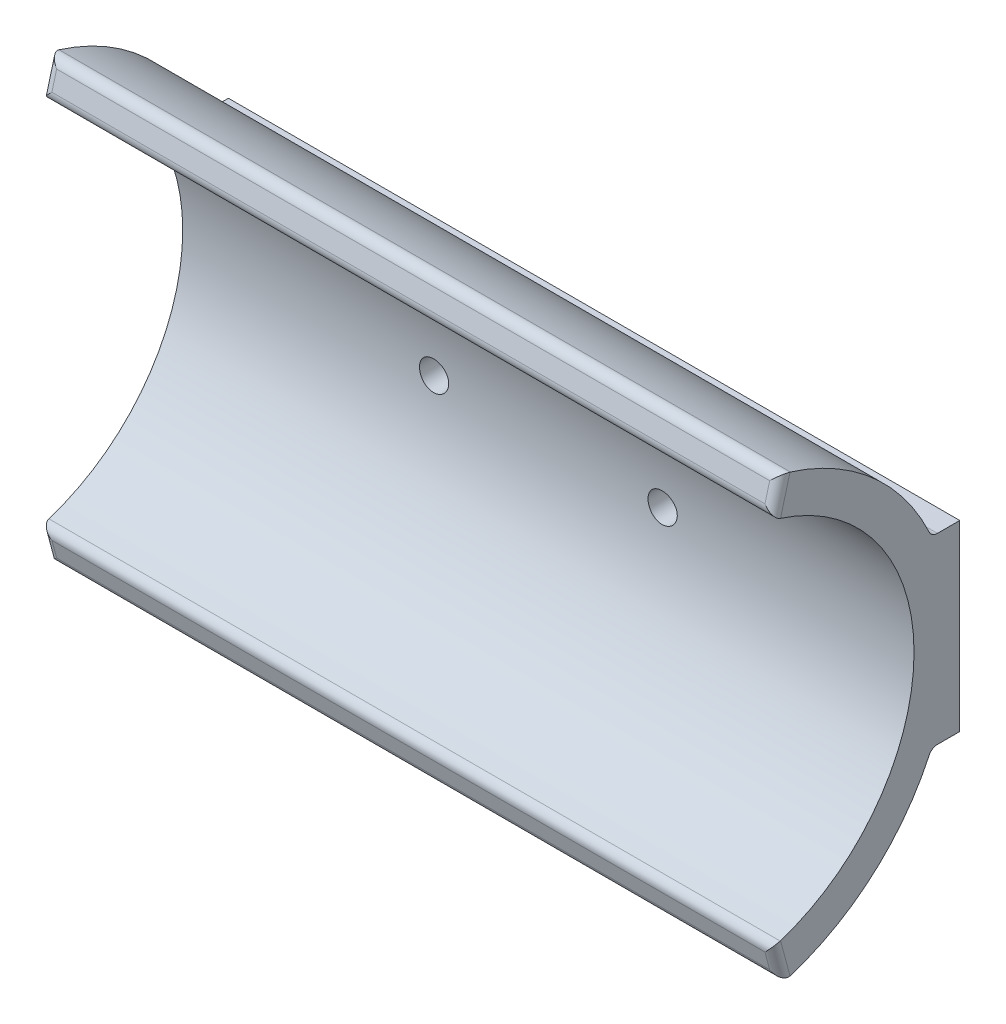
ISO-10303-21;
HEADER;
FILE_DESCRIPTION(('STEP AP214'),'2;1');
FILE_NAME('part.step','',(''),(''),'','','');
FILE_SCHEMA(('AUTOMOTIVE_DESIGN { 1 0 10303 214 1 1 1 1 }'));
ENDSEC;
DATA;
#1=APPLICATION_CONTEXT('core data for automotive mechanical design processes');
#2=APPLICATION_PROTOCOL_DEFINITION('international standard','automotive_design',2000,#1);
#3=PRODUCT_CONTEXT('',#1,'mechanical');
#4=PRODUCT('Part','Part','',(#3));
#5=PRODUCT_RELATED_PRODUCT_CATEGORY('part','',(#4));
#6=PRODUCT_DEFINITION_FORMATION('','',#4);
#7=PRODUCT_DEFINITION_CONTEXT('part definition',#1,'design');
#8=PRODUCT_DEFINITION('design','',#6,#7);
#9=PRODUCT_DEFINITION_SHAPE('','',#8);
#10=(LENGTH_UNIT() NAMED_UNIT(*) SI_UNIT(.MILLI.,.METRE.));
#11=(NAMED_UNIT(*) PLANE_ANGLE_UNIT() SI_UNIT($,.RADIAN.));
#12=(NAMED_UNIT(*) SI_UNIT($,.STERADIAN.) SOLID_ANGLE_UNIT());
#13=UNCERTAINTY_MEASURE_WITH_UNIT(LENGTH_MEASURE(1.E-05),#10,'distance_accuracy_value','');
#14=(GEOMETRIC_REPRESENTATION_CONTEXT(3) GLOBAL_UNCERTAINTY_ASSIGNED_CONTEXT((#13)) GLOBAL_UNIT_ASSIGNED_CONTEXT((#10,
#11,#12)) REPRESENTATION_CONTEXT('',''));
#15=CARTESIAN_POINT('',(0.,0.,0.));
#16=DIRECTION('',(0.,0.,1.));
#17=DIRECTION('',(1.,0.,0.));
#18=AXIS2_PLACEMENT_3D('',#15,#16,#17);
#19=CARTESIAN_POINT('',(40.,0.,0.));
#20=DIRECTION('',(-1.,0.,0.));
#21=DIRECTION('',(0.,0.,1.));
#22=AXIS2_PLACEMENT_3D('',#19,#20,#21);
#23=CYLINDRICAL_SURFACE('',#22,21.);
#24=CARTESIAN_POINT('',(-14.1,0.,-21.));
#25=CARTESIAN_POINT('',(-14.099996069323,0.0897330770531592,-20.9999991969651));
#26=CARTESIAN_POINT('',(-14.0924258440818,0.179527895238753,-20.9994187166968));
#27=CARTESIAN_POINT('',(-14.0623371289664,0.356634966131368,-20.9971588752719));
#28=CARTESIAN_POINT('',(-14.0398015300061,0.443944257992922,-20.995478256419));
#29=CARTESIAN_POINT('',(-13.9804358706692,0.613489451371295,-20.991208132854));
#30=CARTESIAN_POINT('',(-13.9436136936038,0.695728121895897,-20.9886191294623));
#31=CARTESIAN_POINT('',(-13.8567337468738,0.852837088983091,-20.9828228970384));
#32=CARTESIAN_POINT('',(-13.80667888317,0.927708998373876,-20.9796158037834));
#33=CARTESIAN_POINT('',(-13.6946374716135,1.06814082584212,-20.9729357697567));
#34=CARTESIAN_POINT('',(-13.6326283394431,1.13368270334636,-20.9694623334042));
#35=CARTESIAN_POINT('',(-13.4984860136829,1.25343933248057,-20.9626452739666));
#36=CARTESIAN_POINT('',(-13.4263523838933,1.3076535958256,-20.9593016564825));
#37=CARTESIAN_POINT('',(-13.2739014486329,1.40327556522499,-20.9531173038747));
#38=CARTESIAN_POINT('',(-13.1935743276599,1.44466766549411,-20.9502771833377));
#39=CARTESIAN_POINT('',(-13.0270851476432,1.51337061102655,-20.9454267678336));
#40=CARTESIAN_POINT('',(-12.9409231765027,1.54068166837045,-20.9434164603684));
#41=CARTESIAN_POINT('',(-12.7653889719303,1.58039557836974,-20.9404572478363));
#42=CARTESIAN_POINT('',(-12.6760233534877,1.59282751229365,-20.9395062725561));
#43=CARTESIAN_POINT('',(-12.4964691495563,1.60252009577669,-20.9387667777739));
#44=CARTESIAN_POINT('',(-12.4062805772355,1.5997809876624,-20.9389782397043));
#45=CARTESIAN_POINT('',(-12.2278394511928,1.57923330624163,-20.9405378526563));
#46=CARTESIAN_POINT('',(-12.1395832403916,1.56145628607046,-20.941883623605));
#47=CARTESIAN_POINT('',(-11.9673110287154,1.51138639676402,-20.9455564731376));
#48=CARTESIAN_POINT('',(-11.883295063284,1.47909340631434,-20.9478835599225));
#49=CARTESIAN_POINT('',(-11.7217873789787,1.40087274212056,-20.9532595625442));
#50=CARTESIAN_POINT('',(-11.6443025708488,1.35493085305051,-20.956309230275));
#51=CARTESIAN_POINT('',(-11.498132272852,1.25072677797336,-20.9627860404608));
#52=CARTESIAN_POINT('',(-11.4294469315342,1.19246438402043,-20.9662131892865));
#53=CARTESIAN_POINT('',(-11.3026417843017,1.06509590503068,-20.9730693691701));
#54=CARTESIAN_POINT('',(-11.2445493839544,0.995962531176635,-20.9764983827186));
#55=CARTESIAN_POINT('',(-11.1407908527487,0.848909909453537,-20.9829635499802));
#56=CARTESIAN_POINT('',(-11.0951247285168,0.770990656899298,-20.9859997034839));
#57=CARTESIAN_POINT('',(-11.0175169776585,0.608560749575455,-20.9913374907171));
#58=CARTESIAN_POINT('',(-10.9855764989189,0.52404954421358,-20.9936390630089));
#59=CARTESIAN_POINT('',(-10.9363455681781,0.350842585701052,-20.9972476121041));
#60=CARTESIAN_POINT('',(-10.919054862038,0.262146905169334,-20.998554606161));
#61=CARTESIAN_POINT('',(-10.8996485053973,0.0833263729948661,-21.000024515913));
#62=CARTESIAN_POINT('',(-10.8974949869961,-0.00679434661455747,-21.0001902865249));
#63=CARTESIAN_POINT('',(-10.9083250322157,-0.186115607337458,-20.9993666843492));
#64=CARTESIAN_POINT('',(-10.9213084781151,-0.275316155601739,-20.9983773205452));
#65=CARTESIAN_POINT('',(-10.9620125251936,-0.450157511989424,-20.995356592473));
#66=CARTESIAN_POINT('',(-10.9897156408616,-0.535802413997621,-20.9933264646299));
#67=CARTESIAN_POINT('',(-11.059054817289,-0.701227978241171,-20.9884523901379));
#68=CARTESIAN_POINT('',(-11.1006910631142,-0.781008562566994,-20.9856084326793));
#69=CARTESIAN_POINT('',(-11.196810226341,-0.932613551781124,-20.9794186649582));
#70=CARTESIAN_POINT('',(-11.2513183073292,-1.00442196213951,-20.9760718764162));
#71=CARTESIAN_POINT('',(-11.3715974037575,-1.13788293759063,-20.9692559888158));
#72=CARTESIAN_POINT('',(-11.4373685828748,-1.19953535506919,-20.9657868879807));
#73=CARTESIAN_POINT('',(-11.5784708459797,-1.31106354989437,-20.9591089758234));
#74=CARTESIAN_POINT('',(-11.6538214491246,-1.36091466990518,-20.9559007185195));
#75=CARTESIAN_POINT('',(-11.8118461290293,-1.44725626849497,-20.9501152695213));
#76=CARTESIAN_POINT('',(-11.8945201430245,-1.48374686156533,-20.9475380724194));
#77=CARTESIAN_POINT('',(-12.064756494043,-1.54228930662205,-20.9433094374697));
#78=CARTESIAN_POINT('',(-12.1523135604478,-1.56435641162192,-20.941657021921));
#79=CARTESIAN_POINT('',(-12.329903149566,-1.59347519639969,-20.9394616301549));
#80=CARTESIAN_POINT('',(-12.4199356333743,-1.6005271120286,-20.9389186365111));
#81=CARTESIAN_POINT('',(-12.5996752971984,-1.59941280351195,-20.9390037634709));
#82=CARTESIAN_POINT('',(-12.6893827214064,-1.59128532799358,-20.93962890217));
#83=CARTESIAN_POINT('',(-12.8661547938434,-1.56012357425164,-20.9419735258936));
#84=CARTESIAN_POINT('',(-12.9532194377223,-1.53708927149269,-20.9436930127194));
#85=CARTESIAN_POINT('',(-13.1222381797023,-1.47677716767107,-20.9480318155488));
#86=CARTESIAN_POINT('',(-13.2041924623975,-1.43949988143387,-20.9506510990282));
#87=CARTESIAN_POINT('',(-13.3606854100154,-1.35176457118104,-20.9564943867825));
#88=CARTESIAN_POINT('',(-13.4352242195359,-1.30130680424708,-20.9597183792623));
#89=CARTESIAN_POINT('',(-13.574968243485,-1.18849766808519,-20.9664175464917));
#90=CARTESIAN_POINT('',(-13.6401503987429,-1.1261177693736,-20.9698933110801));
#91=CARTESIAN_POINT('',(-13.7591436031842,-0.991283536993342,-20.9766990618792));
#92=CARTESIAN_POINT('',(-13.8129518859295,-0.918826759439664,-20.980029012468));
#93=CARTESIAN_POINT('',(-13.9077296616073,-0.765777630012699,-20.9861729607073));
#94=CARTESIAN_POINT('',(-13.9486781637546,-0.685172257865035,-20.9889861117212));
#95=CARTESIAN_POINT('',(-14.0164084219806,-0.518265139840491,-20.9937691396712));
#96=CARTESIAN_POINT('',(-14.0432065779726,-0.431970119245986,-20.9957399923035));
#97=CARTESIAN_POINT('',(-14.0749977781031,-0.287632324360131,-20.998106452545));
#98=CARTESIAN_POINT('',(-14.0843612770783,-0.230519670008345,-20.9988133291939));
#99=CARTESIAN_POINT('',(-14.096863647679,-0.115613220804631,-20.9997603611356));
#100=CARTESIAN_POINT('',(-14.1000025327282,-0.0578194274218868,-21.0000005174348));
#101=CARTESIAN_POINT('',(-14.1,0.,-21.));
#102=B_SPLINE_CURVE_WITH_KNOTS('',3,(#24,#25,#26,#27,#28,#29,#30,#31,#32,#33,#34,#35,#36,#37,
#38,#39,#40,#41,#42,#43,#44,#45,#46,#47,#48,#49,#50,#51,#52,#53,#54,#55,#56,#57,#58,#59,#60,#61,
#62,#63,#64,#65,#66,#67,#68,#69,#70,#71,#72,#73,#74,#75,#76,#77,#78,#79,#80,#81,#82,#83,#84,#85,
#86,#87,#88,#89,#90,#91,#92,#93,#94,#95,#96,#97,#98,#99,#100,#101),.UNSPECIFIED.,.T.,.F.,(4,2,2,
2,2,2,2,2,2,2,2,2,2,2,2,2,2,2,2,2,2,2,2,2,2,2,2,2,2,2,2,2,2,2,2,2,2,2,4),(0.,0.268988138040392,
0.53828432600933,0.807432127618312,1.07652087212024,1.34612305828163,1.6157368634423,
1.88567753639581,2.15561414353941,2.42502229308292,2.69442613939054,2.96326611012854,
3.23210832768614,3.50123153186155,3.77035927866857,4.04017371606023,4.30998829733486,
4.57982543903044,4.84965789959352,5.11881509356691,5.38797019429725,5.65680627787629,
5.92564593239224,6.19501556625647,6.4643891149785,6.73432061432766,7.00424980047821,
7.27389306940428,7.54353210287909,7.81248376593027,8.08143587165436,8.35037825678181,
8.61931539665318,8.88890434480889,9.15855878914328,9.42865112490225,9.69842973918568,
9.8717523775705,10.0450746421749),.UNSPECIFIED.);
#103=CARTESIAN_POINT('',(-14.1,0.,-21.));
#104=VERTEX_POINT('',#103);
#105=EDGE_CURVE('E220',#104,#104,#102,.T.);
#106=ORIENTED_EDGE('',*,*,#105,.T.);
#107=EDGE_LOOP('',(#106));
#108=FACE_BOUND('',#107,.T.);
#109=CARTESIAN_POINT('',(10.9,0.,-21.));
#110=CARTESIAN_POINT('',(10.900003930677,0.0897330770531592,-20.9999991969651));
#111=CARTESIAN_POINT('',(10.9075741559182,0.179527895238753,-20.9994187166968));
#112=CARTESIAN_POINT('',(10.9376628710336,0.356634966131368,-20.9971588752719));
#113=CARTESIAN_POINT('',(10.9601984699939,0.443944257992922,-20.995478256419));
#114=CARTESIAN_POINT('',(11.0195641293308,0.613489451371295,-20.991208132854));
#115=CARTESIAN_POINT('',(11.0563863063962,0.695728121895897,-20.9886191294623));
#116=CARTESIAN_POINT('',(11.1432662531262,0.85283708898309,-20.9828228970384));
#117=CARTESIAN_POINT('',(11.19332111683,0.927708998373876,-20.9796158037834));
#118=CARTESIAN_POINT('',(11.3053625283865,1.06814082584212,-20.9729357697567));
#119=CARTESIAN_POINT('',(11.3673716605569,1.13368270334636,-20.9694623334042));
#120=CARTESIAN_POINT('',(11.5015139863171,1.25343933248057,-20.9626452739666));
#121=CARTESIAN_POINT('',(11.5736476161067,1.3076535958256,-20.9593016564825));
#122=CARTESIAN_POINT('',(11.7260985513671,1.40327556522499,-20.9531173038747));
#123=CARTESIAN_POINT('',(11.8064256723401,1.44466766549411,-20.9502771833377));
#124=CARTESIAN_POINT('',(11.9729148523568,1.51337061102655,-20.9454267678336));
#125=CARTESIAN_POINT('',(12.0590768234973,1.54068166837045,-20.9434164603684));
#126=CARTESIAN_POINT('',(12.2346110280697,1.58039557836974,-20.9404572478363));
#127=CARTESIAN_POINT('',(12.3239766465123,1.59282751229365,-20.9395062725561));
#128=CARTESIAN_POINT('',(12.5035308504437,1.60252009577669,-20.9387667777739));
#129=CARTESIAN_POINT('',(12.5937194227646,1.5997809876624,-20.9389782397043));
#130=CARTESIAN_POINT('',(12.7721605488072,1.57923330624163,-20.9405378526563));
#131=CARTESIAN_POINT('',(12.8604167596084,1.56145628607047,-20.941883623605));
#132=CARTESIAN_POINT('',(13.0326889712846,1.51138639676402,-20.9455564731376));
#133=CARTESIAN_POINT('',(13.116704936716,1.47909340631434,-20.9478835599225));
#134=CARTESIAN_POINT('',(13.2782126210213,1.40087274212056,-20.9532595625442));
#135=CARTESIAN_POINT('',(13.3556974291512,1.35493085305051,-20.956309230275));
#136=CARTESIAN_POINT('',(13.501867727148,1.25072677797336,-20.9627860404608));
#137=CARTESIAN_POINT('',(13.5705530684658,1.19246438402043,-20.9662131892865));
#138=CARTESIAN_POINT('',(13.6973582156983,1.06509590503068,-20.9730693691701));
#139=CARTESIAN_POINT('',(13.7554506160456,0.995962531176635,-20.9764983827186));
#140=CARTESIAN_POINT('',(13.8592091472513,0.848909909453537,-20.9829635499802));
#141=CARTESIAN_POINT('',(13.9048752714832,0.770990656899298,-20.9859997034839));
#142=CARTESIAN_POINT('',(13.9824830223415,0.608560749575455,-20.9913374907171));
#143=CARTESIAN_POINT('',(14.0144235010811,0.52404954421358,-20.9936390630089));
#144=CARTESIAN_POINT('',(14.0636544318219,0.350842585701052,-20.9972476121041));
#145=CARTESIAN_POINT('',(14.080945137962,0.262146905169334,-20.998554606161));
#146=CARTESIAN_POINT('',(14.1003514946027,0.0833263729948661,-21.000024515913));
#147=CARTESIAN_POINT('',(14.1025050130039,-0.00679434661455748,-21.0001902865249));
#148=CARTESIAN_POINT('',(14.0916749677843,-0.186115607337458,-20.9993666843492));
#149=CARTESIAN_POINT('',(14.0786915218849,-0.275316155601739,-20.9983773205452));
#150=CARTESIAN_POINT('',(14.0379874748064,-0.450157511989424,-20.995356592473));
#151=CARTESIAN_POINT('',(14.0102843591384,-0.535802413997621,-20.9933264646299));
#152=CARTESIAN_POINT('',(13.940945182711,-0.701227978241171,-20.9884523901379));
#153=CARTESIAN_POINT('',(13.8993089368858,-0.781008562566994,-20.9856084326793));
#154=CARTESIAN_POINT('',(13.803189773659,-0.932613551781123,-20.9794186649582));
#155=CARTESIAN_POINT('',(13.7486816926708,-1.00442196213951,-20.9760718764162));
#156=CARTESIAN_POINT('',(13.6284025962425,-1.13788293759063,-20.9692559888158));
#157=CARTESIAN_POINT('',(13.5626314171252,-1.19953535506919,-20.9657868879807));
#158=CARTESIAN_POINT('',(13.4215291540203,-1.31106354989437,-20.9591089758234));
#159=CARTESIAN_POINT('',(13.3461785508754,-1.36091466990518,-20.9559007185195));
#160=CARTESIAN_POINT('',(13.1881538709707,-1.44725626849497,-20.9501152695213));
#161=CARTESIAN_POINT('',(13.1054798569755,-1.48374686156533,-20.9475380724194));
#162=CARTESIAN_POINT('',(12.935243505957,-1.54228930662205,-20.9433094374697));
#163=CARTESIAN_POINT('',(12.8476864395522,-1.56435641162192,-20.941657021921));
#164=CARTESIAN_POINT('',(12.670096850434,-1.59347519639969,-20.9394616301549));
#165=CARTESIAN_POINT('',(12.5800643666257,-1.6005271120286,-20.9389186365111));
#166=CARTESIAN_POINT('',(12.4003247028016,-1.59941280351195,-20.9390037634709));
#167=CARTESIAN_POINT('',(12.3106172785936,-1.59128532799358,-20.93962890217));
#168=CARTESIAN_POINT('',(12.1338452061566,-1.56012357425164,-20.9419735258936));
#169=CARTESIAN_POINT('',(12.0467805622777,-1.53708927149269,-20.9436930127194));
#170=CARTESIAN_POINT('',(11.8777618202977,-1.47677716767107,-20.9480318155488));
#171=CARTESIAN_POINT('',(11.7958075376025,-1.43949988143387,-20.9506510990282));
#172=CARTESIAN_POINT('',(11.6393145899846,-1.35176457118104,-20.9564943867825));
#173=CARTESIAN_POINT('',(11.5647757804641,-1.30130680424708,-20.9597183792623));
#174=CARTESIAN_POINT('',(11.425031756515,-1.18849766808519,-20.9664175464917));
#175=CARTESIAN_POINT('',(11.3598496012571,-1.1261177693736,-20.9698933110801));
#176=CARTESIAN_POINT('',(11.2408563968158,-0.991283536993342,-20.9766990618792));
#177=CARTESIAN_POINT('',(11.1870481140705,-0.918826759439664,-20.980029012468));
#178=CARTESIAN_POINT('',(11.0922703383927,-0.765777630012699,-20.9861729607073));
#179=CARTESIAN_POINT('',(11.0513218362454,-0.685172257865035,-20.9889861117212));
#180=CARTESIAN_POINT('',(10.9835915780194,-0.518265139840491,-20.9937691396712));
#181=CARTESIAN_POINT('',(10.9567934220274,-0.431970119245986,-20.9957399923035));
#182=CARTESIAN_POINT('',(10.9250022218969,-0.287632324360131,-20.998106452545));
#183=CARTESIAN_POINT('',(10.9156387229217,-0.230519670008346,-20.9988133291939));
#184=CARTESIAN_POINT('',(10.903136352321,-0.115613220804631,-20.9997603611356));
#185=CARTESIAN_POINT('',(10.8999974672718,-0.0578194274218868,-21.0000005174348));
#186=CARTESIAN_POINT('',(10.9,0.,-21.));
#187=B_SPLINE_CURVE_WITH_KNOTS('',3,(#109,#110,#111,#112,#113,#114,#115,#116,#117,#118,#119,
#120,#121,#122,#123,#124,#125,#126,#127,#128,#129,#130,#131,#132,#133,#134,#135,#136,#137,#138,
#139,#140,#141,#142,#143,#144,#145,#146,#147,#148,#149,#150,#151,#152,#153,#154,#155,#156,#157,
#158,#159,#160,#161,#162,#163,#164,#165,#166,#167,#168,#169,#170,#171,#172,#173,#174,#175,#176,
#177,#178,#179,#180,#181,#182,#183,#184,#185,#186),.UNSPECIFIED.,.T.,.F.,(4,2,2,2,2,2,2,2,2,2,2,
2,2,2,2,2,2,2,2,2,2,2,2,2,2,2,2,2,2,2,2,2,2,2,2,2,2,2,4),(0.,0.268988138040392,0.53828432600933,
0.807432127618312,1.07652087212024,1.34612305828163,1.6157368634423,1.8856775363958,
2.15561414353941,2.42502229308292,2.69442613939054,2.96326611012854,3.23210832768614,
3.50123153186155,3.77035927866857,4.04017371606024,4.30998829733487,4.57982543903044,
4.84965789959352,5.11881509356691,5.38797019429725,5.65680627787629,5.92564593239224,
6.19501556625647,6.4643891149785,6.73432061432766,7.00424980047821,7.27389306940428,
7.54353210287909,7.81248376593028,8.08143587165436,8.35037825678182,8.61931539665318,
8.8889043448089,9.15855878914329,9.42865112490226,9.69842973918568,9.8717523775705,
10.0450746421749),.UNSPECIFIED.);
#188=CARTESIAN_POINT('',(10.9,0.,-21.));
#189=VERTEX_POINT('',#188);
#190=EDGE_CURVE('E244',#189,#189,#187,.T.);
#191=ORIENTED_EDGE('',*,*,#190,.T.);
#192=EDGE_LOOP('',(#191));
#193=FACE_BOUND('',#192,.T.);
#194=DIRECTION('',(-1.,0.,0.));
#195=VECTOR('',#194,1.);
#196=CARTESIAN_POINT('',(40.,-20.0164219715272,-6.35160227484078));
#197=LINE('',#196,#195);
#198=CARTESIAN_POINT('',(-39.9989664079925,-20.0164219715272,-6.35160227484078));
#199=VERTEX_POINT('',#198);
#200=CARTESIAN_POINT('',(39.9989664079925,-20.0164219715272,-6.35160227484078));
#201=VERTEX_POINT('',#200);
#202=EDGE_CURVE('E316',#199,#201,#197,.F.);
#203=ORIENTED_EDGE('',*,*,#202,.T.);
#204=CARTESIAN_POINT('',(39.9989664079925,-20.0164219715272,-6.35160227484078));
#205=CARTESIAN_POINT('',(39.9993109252826,-20.0141293296096,-6.35882731429294));
#206=CARTESIAN_POINT('',(39.999569316595,-20.0118321794118,-6.36605297093715));
#207=CARTESIAN_POINT('',(39.9999138472641,-20.0072288624555,-6.38050551860969));
#208=CARTESIAN_POINT('',(39.9999999866209,-20.004922695697,-6.38773240963802));
#209=CARTESIAN_POINT('',(40.,-20.0026120206583,-6.39495991785841));
#210=B_SPLINE_CURVE_WITH_KNOTS('',3,(#204,#205,#206,#207,#208,#209),.UNSPECIFIED.,.F.,.F.,(4,2,
4),(0.,0.0227592621008843,0.0455185242017685),.UNSPECIFIED.);
#211=CARTESIAN_POINT('',(40.,-20.0026120206583,-6.39495991785841));
#212=VERTEX_POINT('',#211);
#213=EDGE_CURVE('E328',#201,#212,#210,.T.);
#214=ORIENTED_EDGE('',*,*,#213,.T.);
#215=CARTESIAN_POINT('',(40.,0.,0.));
#216=DIRECTION('',(-1.,0.,0.));
#217=DIRECTION('',(0.,0.,-1.));
#218=AXIS2_PLACEMENT_3D('',#215,#216,#217);
#219=CIRCLE('',#218,21.);
#220=CARTESIAN_POINT('',(40.,20.0026120206583,-6.3949599178584));
#221=VERTEX_POINT('',#220);
#222=EDGE_CURVE('E237',#221,#212,#219,.T.);
#223=ORIENTED_EDGE('',*,*,#222,.F.);
#224=CARTESIAN_POINT('',(40.,20.0026120206583,-6.3949599178584));
#225=CARTESIAN_POINT('',(39.9999999866209,20.004922695697,-6.38773240963801));
#226=CARTESIAN_POINT('',(39.9999138472641,20.0072288624555,-6.38050551860969));
#227=CARTESIAN_POINT('',(39.9995693165949,20.0118321794118,-6.36605297093714));
#228=CARTESIAN_POINT('',(39.9993109252826,20.0141293296096,-6.35882731429293));
#229=CARTESIAN_POINT('',(39.9989664079925,20.0164219715272,-6.35160227484078));
#230=B_SPLINE_CURVE_WITH_KNOTS('',3,(#224,#225,#226,#227,#228,#229),.UNSPECIFIED.,.F.,.F.,(4,2,
4),(0.,0.0227592621008844,0.0455185242017693),.UNSPECIFIED.);
#231=CARTESIAN_POINT('',(39.9989664079925,20.0164219715272,-6.35160227484078));
#232=VERTEX_POINT('',#231);
#233=EDGE_CURVE('E303',#221,#232,#230,.T.);
#234=ORIENTED_EDGE('',*,*,#233,.T.);
#235=DIRECTION('',(-1.,0.,0.));
#236=VECTOR('',#235,1.);
#237=CARTESIAN_POINT('',(40.,20.0164219715272,-6.35160227484078));
#238=LINE('',#237,#236);
#239=CARTESIAN_POINT('',(-39.9989664079925,20.0164219715272,-6.35160227484078));
#240=VERTEX_POINT('',#239);
#241=EDGE_CURVE('E271',#232,#240,#238,.T.);
#242=ORIENTED_EDGE('',*,*,#241,.T.);
#243=CARTESIAN_POINT('',(-39.9989664079925,20.0164219715272,-6.35160227484078));
#244=CARTESIAN_POINT('',(-39.9993109252826,20.0141293296096,-6.35882731429293));
#245=CARTESIAN_POINT('',(-39.9995693165949,20.0118321794118,-6.36605297093714));
#246=CARTESIAN_POINT('',(-39.9999138472641,20.0072288624555,-6.38050551860968));
#247=CARTESIAN_POINT('',(-39.9999999866209,20.004922695697,-6.38773240963801));
#248=CARTESIAN_POINT('',(-40.,20.0026120206583,-6.3949599178584));
#249=B_SPLINE_CURVE_WITH_KNOTS('',3,(#243,#244,#245,#246,#247,#248),.UNSPECIFIED.,.F.,.F.,(4,2,
4),(0.,0.0227592621008854,0.0455185242017696),.UNSPECIFIED.);
#250=CARTESIAN_POINT('',(-40.,20.0026120206583,-6.3949599178584));
#251=VERTEX_POINT('',#250);
#252=EDGE_CURVE('E262',#240,#251,#249,.T.);
#253=ORIENTED_EDGE('',*,*,#252,.T.);
#254=CARTESIAN_POINT('',(-40.,0.,0.));
#255=DIRECTION('',(-1.,0.,0.));
#256=DIRECTION('',(0.,0.,-1.));
#257=AXIS2_PLACEMENT_3D('',#254,#255,#256);
#258=CIRCLE('',#257,21.);
#259=CARTESIAN_POINT('',(-40.,-20.0026120206583,-6.3949599178584));
#260=VERTEX_POINT('',#259);
#261=EDGE_CURVE('E215',#251,#260,#258,.T.);
#262=ORIENTED_EDGE('',*,*,#261,.T.);
#263=CARTESIAN_POINT('',(-40.,-20.0026120206583,-6.3949599178584));
#264=CARTESIAN_POINT('',(-39.9999999866209,-20.004922695697,-6.38773240963802));
#265=CARTESIAN_POINT('',(-39.9999138472641,-20.0072288624555,-6.38050551860969));
#266=CARTESIAN_POINT('',(-39.9995693165949,-20.0118321794118,-6.36605297093715));
#267=CARTESIAN_POINT('',(-39.9993109252826,-20.0141293296096,-6.35882731429294));
#268=CARTESIAN_POINT('',(-39.9989664079925,-20.0164219715272,-6.35160227484078));
#269=B_SPLINE_CURVE_WITH_KNOTS('',3,(#263,#264,#265,#266,#267,#268),.UNSPECIFIED.,.F.,.F.,(4,2,
4),(0.,0.0227592621008833,0.0455185242017666),.UNSPECIFIED.);
#270=EDGE_CURVE('E309',#260,#199,#269,.T.);
#271=ORIENTED_EDGE('',*,*,#270,.T.);
#272=EDGE_LOOP('',(#203,#214,#223,#234,#242,#253,#262,#271));
#273=FACE_BOUND('',#272,.T.);
#274=ADVANCED_FACE('F48',(#108,#193,#273),#23,.F.);
#275=CARTESIAN_POINT('',(40.,-20.2844423520705,-5.4351999471528));
#276=DIRECTION('',(0.,0.258819045102514,-0.96592582628907));
#277=DIRECTION('',(0.,0.96592582628907,0.258819045102514));
#278=AXIS2_PLACEMENT_3D('',#275,#276,#277);
#279=PLANE('',#278);
#280=DIRECTION('',(0.,-0.96592582628907,-0.258819045102514));
#281=VECTOR('',#280,1.);
#282=CARTESIAN_POINT('',(39.,-20.2844423520705,-5.4351999471528));
#283=LINE('',#282,#281);
#284=CARTESIAN_POINT('',(39.,-23.162087634495,-6.20626267668168));
#285=VERTEX_POINT('',#284);
#286=CARTESIAN_POINT('',(39.,-21.2284039676548,-5.68813369973461));
#287=VERTEX_POINT('',#286);
#288=EDGE_CURVE('E255',#285,#287,#283,.F.);
#289=ORIENTED_EDGE('',*,*,#288,.T.);
#290=DIRECTION('',(-1.,0.,0.));
#291=VECTOR('',#290,1.);
#292=CARTESIAN_POINT('',(40.,-21.2284039676548,-5.68813369973461));
#293=LINE('',#292,#291);
#294=CARTESIAN_POINT('',(-39.,-21.2284039676548,-5.68813369973461));
#295=VERTEX_POINT('',#294);
#296=EDGE_CURVE('E258',#287,#295,#293,.T.);
#297=ORIENTED_EDGE('',*,*,#296,.T.);
#298=DIRECTION('',(0.,-0.96592582628907,-0.258819045102514));
#299=VECTOR('',#298,1.);
#300=CARTESIAN_POINT('',(-39.,-20.2844423520705,-5.4351999471528));
#301=LINE('',#300,#299);
#302=CARTESIAN_POINT('',(-39.,-23.162087634495,-6.20626267668168));
#303=VERTEX_POINT('',#302);
#304=EDGE_CURVE('E198',#295,#303,#301,.T.);
#305=ORIENTED_EDGE('',*,*,#304,.T.);
#306=DIRECTION('',(-1.,0.,0.));
#307=VECTOR('',#306,1.);
#308=CARTESIAN_POINT('',(40.,-23.162087634495,-6.20626267668168));
#309=LINE('',#308,#307);
#310=EDGE_CURVE('E252',#303,#285,#309,.F.);
#311=ORIENTED_EDGE('',*,*,#310,.T.);
#312=EDGE_LOOP('',(#289,#297,#305,#311));
#313=FACE_BOUND('',#312,.T.);
#314=ADVANCED_FACE('F281',(#313),#279,.F.);
#315=CARTESIAN_POINT('',(40.,0.,0.));
#316=DIRECTION('',(-1.,0.,0.));
#317=DIRECTION('',(0.,0.,1.));
#318=AXIS2_PLACEMENT_3D('',#315,#316,#317);
#319=CYLINDRICAL_SURFACE('',#318,25.);
#320=CARTESIAN_POINT('',(40.,0.,0.));
#321=DIRECTION('',(1.,0.,0.));
#322=DIRECTION('',(0.,0.,-1.));
#323=AXIS2_PLACEMENT_3D('',#320,#321,#322);
#324=CIRCLE('',#323,25.);
#325=CARTESIAN_POINT('',(40.,-23.8575714472839,-7.47102969059453));
#326=VERTEX_POINT('',#325);
#327=CARTESIAN_POINT('',(40.,-10.5769230769231,-22.6523442103649));
#328=VERTEX_POINT('',#327);
#329=EDGE_CURVE('E188',#326,#328,#324,.T.);
#330=ORIENTED_EDGE('',*,*,#329,.F.);
#331=DIRECTION('',(-1.,0.,0.));
#332=VECTOR('',#331,1.);
#333=CARTESIAN_POINT('',(40.,-23.8575714472839,-7.47102969059453));
#334=LINE('',#333,#332);
#335=CARTESIAN_POINT('',(-40.,-23.8575714472839,-7.47102969059453));
#336=VERTEX_POINT('',#335);
#337=EDGE_CURVE('E350',#326,#336,#334,.T.);
#338=ORIENTED_EDGE('',*,*,#337,.T.);
#339=CARTESIAN_POINT('',(-40.,0.,0.));
#340=DIRECTION('',(1.,0.,0.));
#341=DIRECTION('',(0.,0.,-1.));
#342=AXIS2_PLACEMENT_3D('',#339,#340,#341);
#343=CIRCLE('',#342,25.);
#344=CARTESIAN_POINT('',(-40.,-10.5769230769231,-22.6523442103649));
#345=VERTEX_POINT('',#344);
#346=EDGE_CURVE('E219',#336,#345,#343,.T.);
#347=ORIENTED_EDGE('',*,*,#346,.T.);
#348=DIRECTION('',(-1.,0.,0.));
#349=VECTOR('',#348,1.);
#350=CARTESIAN_POINT('',(40.,-10.5769230769231,-22.6523442103649));
#351=LINE('',#350,#349);
#352=EDGE_CURVE('E347',#345,#328,#351,.F.);
#353=ORIENTED_EDGE('',*,*,#352,.T.);
#354=EDGE_LOOP('',(#330,#338,#347,#353));
#355=FACE_BOUND('',#354,.T.);
#356=ADVANCED_FACE('F486',(#355),#319,.T.);
#357=CARTESIAN_POINT('',(40.,-10.,-22.9128784747792));
#358=DIRECTION('',(0.,1.,0.));
#359=DIRECTION('',(0.,0.,1.));
#360=AXIS2_PLACEMENT_3D('',#357,#358,#359);
#361=PLANE('',#360);
#362=DIRECTION('',(0.,0.,-1.));
#363=VECTOR('',#362,1.);
#364=CARTESIAN_POINT('',(40.,-10.,-22.9128784747792));
#365=LINE('',#364,#363);
#366=CARTESIAN_POINT('',(40.,-10.,-23.5584379787795));
#367=VERTEX_POINT('',#366);
#368=CARTESIAN_POINT('',(40.,-10.,-26.));
#369=VERTEX_POINT('',#368);
#370=EDGE_CURVE('E174',#367,#369,#365,.T.);
#371=ORIENTED_EDGE('',*,*,#370,.F.);
#372=DIRECTION('',(1.,0.,0.));
#373=VECTOR('',#372,1.);
#374=CARTESIAN_POINT('',(-40.,-10.,-23.5584379787795));
#375=LINE('',#374,#373);
#376=CARTESIAN_POINT('',(-40.,-10.,-23.5584379787795));
#377=VERTEX_POINT('',#376);
#378=EDGE_CURVE('E386',#367,#377,#375,.F.);
#379=ORIENTED_EDGE('',*,*,#378,.T.);
#380=DIRECTION('',(0.,0.,-1.));
#381=VECTOR('',#380,1.);
#382=CARTESIAN_POINT('',(-40.,-10.,-22.9128784747792));
#383=LINE('',#382,#381);
#384=CARTESIAN_POINT('',(-40.,-10.,-26.));
#385=VERTEX_POINT('',#384);
#386=EDGE_CURVE('E194',#377,#385,#383,.T.);
#387=ORIENTED_EDGE('',*,*,#386,.T.);
#388=DIRECTION('',(-1.,0.,0.));
#389=VECTOR('',#388,1.);
#390=CARTESIAN_POINT('',(40.,-10.,-26.));
#391=LINE('',#390,#389);
#392=EDGE_CURVE('E191',#369,#385,#391,.T.);
#393=ORIENTED_EDGE('',*,*,#392,.F.);
#394=EDGE_LOOP('',(#371,#379,#387,#393));
#395=FACE_BOUND('',#394,.T.);
#396=ADVANCED_FACE('F192',(#395),#361,.F.);
#397=CARTESIAN_POINT('',(40.,-10.,-26.));
#398=DIRECTION('',(0.,0.,1.));
#399=DIRECTION('',(1.,0.,0.));
#400=AXIS2_PLACEMENT_3D('',#397,#398,#399);
#401=PLANE('',#400);
#402=CARTESIAN_POINT('',(-12.5,0.,-26.));
#403=DIRECTION('',(0.,0.,1.));
#404=DIRECTION('',(1.,0.,0.));
#405=AXIS2_PLACEMENT_3D('',#402,#403,#404);
#406=CIRCLE('',#405,1.6);
#407=CARTESIAN_POINT('',(-10.9,0.,-26.));
#408=VERTEX_POINT('',#407);
#409=EDGE_CURVE('E246',#408,#408,#406,.T.);
#410=ORIENTED_EDGE('',*,*,#409,.T.);
#411=EDGE_LOOP('',(#410));
#412=FACE_BOUND('',#411,.T.);
#413=CARTESIAN_POINT('',(12.5,0.,-26.));
#414=DIRECTION('',(0.,0.,1.));
#415=DIRECTION('',(1.,0.,0.));
#416=AXIS2_PLACEMENT_3D('',#413,#414,#415);
#417=CIRCLE('',#416,1.6);
#418=CARTESIAN_POINT('',(14.1,0.,-26.));
#419=VERTEX_POINT('',#418);
#420=EDGE_CURVE('E240',#419,#419,#417,.T.);
#421=ORIENTED_EDGE('',*,*,#420,.T.);
#422=EDGE_LOOP('',(#421));
#423=FACE_BOUND('',#422,.T.);
#424=DIRECTION('',(0.,1.,0.));
#425=VECTOR('',#424,1.);
#426=CARTESIAN_POINT('',(-40.,-10.,-26.));
#427=LINE('',#426,#425);
#428=CARTESIAN_POINT('',(-40.,10.,-26.));
#429=VERTEX_POINT('',#428);
#430=EDGE_CURVE('E226',#385,#429,#427,.T.);
#431=ORIENTED_EDGE('',*,*,#430,.T.);
#432=DIRECTION('',(-1.,0.,0.));
#433=VECTOR('',#432,1.);
#434=CARTESIAN_POINT('',(40.,10.,-26.));
#435=LINE('',#434,#433);
#436=CARTESIAN_POINT('',(40.,10.,-26.));
#437=VERTEX_POINT('',#436);
#438=EDGE_CURVE('E199',#437,#429,#435,.T.);
#439=ORIENTED_EDGE('',*,*,#438,.F.);
#440=DIRECTION('',(0.,1.,0.));
#441=VECTOR('',#440,1.);
#442=CARTESIAN_POINT('',(40.,-10.,-26.));
#443=LINE('',#442,#441);
#444=EDGE_CURVE('E180',#369,#437,#443,.T.);
#445=ORIENTED_EDGE('',*,*,#444,.F.);
#446=ORIENTED_EDGE('',*,*,#392,.T.);
#447=EDGE_LOOP('',(#431,#439,#445,#446));
#448=FACE_BOUND('',#447,.T.);
#449=ADVANCED_FACE('F201',(#412,#423,#448),#401,.F.);
#450=CARTESIAN_POINT('',(40.,10.,-22.9128784747792));
#451=DIRECTION('',(0.,-1.,0.));
#452=DIRECTION('',(0.,0.,-1.));
#453=AXIS2_PLACEMENT_3D('',#450,#451,#452);
#454=PLANE('',#453);
#455=DIRECTION('',(0.,0.,1.));
#456=VECTOR('',#455,1.);
#457=CARTESIAN_POINT('',(-40.,10.,-22.9128784747792));
#458=LINE('',#457,#456);
#459=CARTESIAN_POINT('',(-40.,10.,-23.5584379787795));
#460=VERTEX_POINT('',#459);
#461=EDGE_CURVE('E229',#429,#460,#458,.T.);
#462=ORIENTED_EDGE('',*,*,#461,.T.);
#463=DIRECTION('',(1.,0.,0.));
#464=VECTOR('',#463,1.);
#465=CARTESIAN_POINT('',(40.,10.,-23.5584379787795));
#466=LINE('',#465,#464);
#467=CARTESIAN_POINT('',(40.,10.,-23.5584379787795));
#468=VERTEX_POINT('',#467);
#469=EDGE_CURVE('E383',#460,#468,#466,.T.);
#470=ORIENTED_EDGE('',*,*,#469,.T.);
#471=DIRECTION('',(0.,0.,1.));
#472=VECTOR('',#471,1.);
#473=CARTESIAN_POINT('',(40.,10.,-22.9128784747792));
#474=LINE('',#473,#472);
#475=EDGE_CURVE('E205',#437,#468,#474,.T.);
#476=ORIENTED_EDGE('',*,*,#475,.F.);
#477=ORIENTED_EDGE('',*,*,#438,.T.);
#478=EDGE_LOOP('',(#462,#470,#476,#477));
#479=FACE_BOUND('',#478,.T.);
#480=ADVANCED_FACE('F452',(#479),#454,.F.);
#481=CARTESIAN_POINT('',(40.,0.,0.));
#482=DIRECTION('',(-1.,0.,0.));
#483=DIRECTION('',(0.,0.,1.));
#484=AXIS2_PLACEMENT_3D('',#481,#482,#483);
#485=CYLINDRICAL_SURFACE('',#484,25.);
#486=CARTESIAN_POINT('',(-40.,0.,0.));
#487=DIRECTION('',(1.,0.,0.));
#488=DIRECTION('',(0.,0.,-1.));
#489=AXIS2_PLACEMENT_3D('',#486,#487,#488);
#490=CIRCLE('',#489,25.);
#491=CARTESIAN_POINT('',(-40.,10.5769230769231,-22.6523442103649));
#492=VERTEX_POINT('',#491);
#493=CARTESIAN_POINT('',(-40.,23.8575714472839,-7.47102969059452));
#494=VERTEX_POINT('',#493);
#495=EDGE_CURVE('E233',#492,#494,#490,.T.);
#496=ORIENTED_EDGE('',*,*,#495,.T.);
#497=DIRECTION('',(-1.,0.,0.));
#498=VECTOR('',#497,1.);
#499=CARTESIAN_POINT('',(40.,23.8575714472839,-7.47102969059453));
#500=LINE('',#499,#498);
#501=CARTESIAN_POINT('',(40.,23.8575714472839,-7.47102969059453));
#502=VERTEX_POINT('',#501);
#503=EDGE_CURVE('E379',#494,#502,#500,.F.);
#504=ORIENTED_EDGE('',*,*,#503,.T.);
#505=CARTESIAN_POINT('',(40.,0.,0.));
#506=DIRECTION('',(1.,0.,0.));
#507=DIRECTION('',(0.,0.,-1.));
#508=AXIS2_PLACEMENT_3D('',#505,#506,#507);
#509=CIRCLE('',#508,25.);
#510=CARTESIAN_POINT('',(40.,10.5769230769231,-22.6523442103649));
#511=VERTEX_POINT('',#510);
#512=EDGE_CURVE('E208',#511,#502,#509,.T.);
#513=ORIENTED_EDGE('',*,*,#512,.F.);
#514=DIRECTION('',(-1.,0.,0.));
#515=VECTOR('',#514,1.);
#516=CARTESIAN_POINT('',(40.,10.5769230769231,-22.6523442103649));
#517=LINE('',#516,#515);
#518=EDGE_CURVE('E375',#511,#492,#517,.T.);
#519=ORIENTED_EDGE('',*,*,#518,.T.);
#520=EDGE_LOOP('',(#496,#504,#513,#519));
#521=FACE_BOUND('',#520,.T.);
#522=ADVANCED_FACE('F461',(#521),#485,.T.);
#523=CARTESIAN_POINT('',(40.,20.2844423520705,-5.4351999471528));
#524=DIRECTION('',(0.,-0.258819045102514,-0.96592582628907));
#525=DIRECTION('',(0.,0.96592582628907,-0.258819045102514));
#526=AXIS2_PLACEMENT_3D('',#523,#524,#525);
#527=PLANE('',#526);
#528=DIRECTION('',(0.,-0.96592582628907,0.258819045102514));
#529=VECTOR('',#528,1.);
#530=CARTESIAN_POINT('',(39.,24.1481456572268,-6.47047612756286));
#531=LINE('',#530,#529);
#532=CARTESIAN_POINT('',(39.,21.2284039676548,-5.6881336997346));
#533=VERTEX_POINT('',#532);
#534=CARTESIAN_POINT('',(39.,23.162087634495,-6.20626267668167));
#535=VERTEX_POINT('',#534);
#536=EDGE_CURVE('E66',#533,#535,#531,.F.);
#537=ORIENTED_EDGE('',*,*,#536,.T.);
#538=DIRECTION('',(-1.,0.,0.));
#539=VECTOR('',#538,1.);
#540=CARTESIAN_POINT('',(40.,23.162087634495,-6.20626267668167));
#541=LINE('',#540,#539);
#542=CARTESIAN_POINT('',(-39.,23.162087634495,-6.20626267668167));
#543=VERTEX_POINT('',#542);
#544=EDGE_CURVE('E372',#535,#543,#541,.T.);
#545=ORIENTED_EDGE('',*,*,#544,.T.);
#546=DIRECTION('',(0.,-0.96592582628907,0.258819045102514));
#547=VECTOR('',#546,1.);
#548=CARTESIAN_POINT('',(-39.,20.2844423520705,-5.4351999471528));
#549=LINE('',#548,#547);
#550=CARTESIAN_POINT('',(-39.,21.2284039676548,-5.6881336997346));
#551=VERTEX_POINT('',#550);
#552=EDGE_CURVE('E365',#543,#551,#549,.T.);
#553=ORIENTED_EDGE('',*,*,#552,.T.);
#554=DIRECTION('',(-1.,0.,0.));
#555=VECTOR('',#554,1.);
#556=CARTESIAN_POINT('',(40.,21.2284039676548,-5.6881336997346));
#557=LINE('',#556,#555);
#558=EDGE_CURVE('E71',#551,#533,#557,.F.);
#559=ORIENTED_EDGE('',*,*,#558,.T.);
#560=EDGE_LOOP('',(#537,#545,#553,#559));
#561=FACE_BOUND('',#560,.T.);
#562=ADVANCED_FACE('F470',(#561),#527,.F.);
#563=CARTESIAN_POINT('',(40.,0.,0.));
#564=DIRECTION('',(1.,0.,0.));
#565=DIRECTION('',(0.,0.,-1.));
#566=AXIS2_PLACEMENT_3D('',#563,#564,#565);
#567=PLANE('',#566);
#568=ORIENTED_EDGE('',*,*,#222,.T.);
#569=DIRECTION('',(0.,-0.96592582628907,-0.258819045102514));
#570=VECTOR('',#569,1.);
#571=CARTESIAN_POINT('',(40.,-23.8893266121242,-7.43640195385193));
#572=LINE('',#571,#570);
#573=CARTESIAN_POINT('',(40.,-23.8691944156816,-7.43100754807326));
#574=VERTEX_POINT('',#573);
#575=EDGE_CURVE('E344',#212,#574,#572,.T.);
#576=ORIENTED_EDGE('',*,*,#575,.T.);
#577=CARTESIAN_POINT('',(40.,-22.9032685893925,-7.17218850297075));
#578=DIRECTION('',(1.,0.,0.));
#579=DIRECTION('',(0.,0.,-1.));
#580=AXIS2_PLACEMENT_3D('',#577,#578,#579);
#581=CIRCLE('',#580,1.);
#582=EDGE_CURVE('E341',#574,#326,#581,.T.);
#583=ORIENTED_EDGE('',*,*,#582,.T.);
#584=ORIENTED_EDGE('',*,*,#329,.T.);
#585=CARTESIAN_POINT('',(40.,-11.,-23.5584379787795));
#586=DIRECTION('',(1.,0.,0.));
#587=DIRECTION('',(0.,0.,-1.));
#588=AXIS2_PLACEMENT_3D('',#585,#586,#587);
#589=CIRCLE('',#588,1.);
#590=EDGE_CURVE('E11',#328,#367,#589,.F.);
#591=ORIENTED_EDGE('',*,*,#590,.T.);
#592=ORIENTED_EDGE('',*,*,#370,.T.);
#593=ORIENTED_EDGE('',*,*,#444,.T.);
#594=ORIENTED_EDGE('',*,*,#475,.T.);
#595=CARTESIAN_POINT('',(40.,11.,-23.5584379787795));
#596=DIRECTION('',(1.,0.,0.));
#597=DIRECTION('',(0.,0.,-1.));
#598=AXIS2_PLACEMENT_3D('',#595,#596,#597);
#599=CIRCLE('',#598,1.);
#600=EDGE_CURVE('E392',#468,#511,#599,.F.);
#601=ORIENTED_EDGE('',*,*,#600,.T.);
#602=ORIENTED_EDGE('',*,*,#512,.T.);
#603=CARTESIAN_POINT('',(40.,22.9032685893925,-7.17218850297074));
#604=DIRECTION('',(1.,0.,0.));
#605=DIRECTION('',(0.,0.,-1.));
#606=AXIS2_PLACEMENT_3D('',#603,#604,#605);
#607=CIRCLE('',#606,1.);
#608=CARTESIAN_POINT('',(40.,23.8691944156816,-7.43100754807326));
#609=VERTEX_POINT('',#608);
#610=EDGE_CURVE('E338',#502,#609,#607,.T.);
#611=ORIENTED_EDGE('',*,*,#610,.T.);
#612=DIRECTION('',(0.,-0.96592582628907,0.258819045102514));
#613=VECTOR('',#612,1.);
#614=CARTESIAN_POINT('',(40.,20.025623306968,-6.40112577344187));
#615=LINE('',#614,#613);
#616=EDGE_CURVE('E335',#609,#221,#615,.T.);
#617=ORIENTED_EDGE('',*,*,#616,.T.);
#618=EDGE_LOOP('',(#568,#576,#583,#584,#591,#592,#593,#594,#601,#602,#611,#617));
#619=FACE_BOUND('',#618,.T.);
#620=ADVANCED_FACE('F177',(#619),#567,.T.);
#621=CARTESIAN_POINT('',(-40.,0.,0.));
#622=DIRECTION('',(1.,0.,0.));
#623=DIRECTION('',(0.,0.,-1.));
#624=AXIS2_PLACEMENT_3D('',#621,#622,#623);
#625=PLANE('',#624);
#626=ORIENTED_EDGE('',*,*,#346,.F.);
#627=CARTESIAN_POINT('',(-40.,-22.9032685893925,-7.17218850297075));
#628=DIRECTION('',(1.,0.,0.));
#629=DIRECTION('',(0.,0.,-1.));
#630=AXIS2_PLACEMENT_3D('',#627,#628,#629);
#631=CIRCLE('',#630,1.);
#632=CARTESIAN_POINT('',(-40.,-23.8691944156816,-7.43100754807326));
#633=VERTEX_POINT('',#632);
#634=EDGE_CURVE('E362',#336,#633,#631,.F.);
#635=ORIENTED_EDGE('',*,*,#634,.T.);
#636=DIRECTION('',(0.,-0.96592582628907,-0.258819045102514));
#637=VECTOR('',#636,1.);
#638=CARTESIAN_POINT('',(-40.,0.258819045102515,-0.965925826289072));
#639=LINE('',#638,#637);
#640=EDGE_CURVE('E359',#633,#260,#639,.F.);
#641=ORIENTED_EDGE('',*,*,#640,.T.);
#642=ORIENTED_EDGE('',*,*,#261,.F.);
#643=DIRECTION('',(0.,-0.96592582628907,0.258819045102514));
#644=VECTOR('',#643,1.);
#645=CARTESIAN_POINT('',(-40.,-0.258819045102514,-0.965925826289069));
#646=LINE('',#645,#644);
#647=CARTESIAN_POINT('',(-40.,23.8691944156816,-7.43100754807326));
#648=VERTEX_POINT('',#647);
#649=EDGE_CURVE('E353',#251,#648,#646,.F.);
#650=ORIENTED_EDGE('',*,*,#649,.T.);
#651=CARTESIAN_POINT('',(-40.,22.9032685893925,-7.17218850297074));
#652=DIRECTION('',(1.,0.,0.));
#653=DIRECTION('',(0.,0.,-1.));
#654=AXIS2_PLACEMENT_3D('',#651,#652,#653);
#655=CIRCLE('',#654,1.);
#656=EDGE_CURVE('E356',#648,#494,#655,.F.);
#657=ORIENTED_EDGE('',*,*,#656,.T.);
#658=ORIENTED_EDGE('',*,*,#495,.F.);
#659=CARTESIAN_POINT('',(-40.,11.,-23.5584379787795));
#660=DIRECTION('',(1.,0.,0.));
#661=DIRECTION('',(0.,0.,-1.));
#662=AXIS2_PLACEMENT_3D('',#659,#660,#661);
#663=CIRCLE('',#662,1.);
#664=EDGE_CURVE('E389',#492,#460,#663,.T.);
#665=ORIENTED_EDGE('',*,*,#664,.T.);
#666=ORIENTED_EDGE('',*,*,#461,.F.);
#667=ORIENTED_EDGE('',*,*,#430,.F.);
#668=ORIENTED_EDGE('',*,*,#386,.F.);
#669=CARTESIAN_POINT('',(-40.,-11.,-23.5584379787795));
#670=DIRECTION('',(1.,0.,0.));
#671=DIRECTION('',(0.,0.,-1.));
#672=AXIS2_PLACEMENT_3D('',#669,#670,#671);
#673=CIRCLE('',#672,1.);
#674=EDGE_CURVE('E58',#377,#345,#673,.T.);
#675=ORIENTED_EDGE('',*,*,#674,.T.);
#676=EDGE_LOOP('',(#626,#635,#641,#642,#650,#657,#658,#665,#666,#667,#668,#675));
#677=FACE_BOUND('',#676,.T.);
#678=ADVANCED_FACE('F449',(#677),#625,.F.);
#679=CARTESIAN_POINT('',(12.5,0.,-5.4351999471528));
#680=DIRECTION('',(0.,0.,-1.));
#681=DIRECTION('',(-1.,0.,0.));
#682=AXIS2_PLACEMENT_3D('',#679,#680,#681);
#683=CYLINDRICAL_SURFACE('',#682,1.6);
#684=ORIENTED_EDGE('',*,*,#420,.F.);
#685=EDGE_LOOP('',(#684));
#686=FACE_BOUND('',#685,.T.);
#687=ORIENTED_EDGE('',*,*,#190,.F.);
#688=EDGE_LOOP('',(#687));
#689=FACE_BOUND('',#688,.T.);
#690=ADVANCED_FACE('F506',(#686,#689),#683,.F.);
#691=CARTESIAN_POINT('',(-12.5,0.,-5.4351999471528));
#692=DIRECTION('',(0.,0.,-1.));
#693=DIRECTION('',(-1.,0.,0.));
#694=AXIS2_PLACEMENT_3D('',#691,#692,#693);
#695=CYLINDRICAL_SURFACE('',#694,1.6);
#696=ORIENTED_EDGE('',*,*,#409,.F.);
#697=EDGE_LOOP('',(#696));
#698=FACE_BOUND('',#697,.T.);
#699=ORIENTED_EDGE('',*,*,#105,.F.);
#700=EDGE_LOOP('',(#699));
#701=FACE_BOUND('',#700,.T.);
#702=ADVANCED_FACE('F510',(#698,#701),#695,.F.);
#703=CARTESIAN_POINT('',(40.,-22.9032685893925,-7.17218850297075));
#704=DIRECTION('',(-1.,0.,0.));
#705=DIRECTION('',(0.,0.,1.));
#706=AXIS2_PLACEMENT_3D('',#703,#704,#705);
#707=CYLINDRICAL_SURFACE('',#706,1.);
#708=ORIENTED_EDGE('',*,*,#337,.F.);
#709=ORIENTED_EDGE('',*,*,#582,.F.);
#710=CARTESIAN_POINT('',(39.,-22.9032685893925,-7.17218850297075));
#711=DIRECTION('',(-0.707106781186547,-0.68301270189222,-0.183012701892215));
#712=DIRECTION('',(-0.707106781186547,0.68301270189222,0.183012701892215));
#713=AXIS2_PLACEMENT_3D('',#710,#711,#712);
#714=ELLIPSE('',#713,1.41421356237309,1.);
#715=EDGE_CURVE('E245',#285,#574,#714,.F.);
#716=ORIENTED_EDGE('',*,*,#715,.F.);
#717=ORIENTED_EDGE('',*,*,#310,.F.);
#718=CARTESIAN_POINT('',(-39.,-22.9032685893925,-7.17218850297075));
#719=DIRECTION('',(0.707106781186547,-0.68301270189222,-0.183012701892215));
#720=DIRECTION('',(-0.707106781186547,-0.68301270189222,-0.183012701892215));
#721=AXIS2_PLACEMENT_3D('',#718,#719,#720);
#722=ELLIPSE('',#721,1.41421356237309,1.);
#723=EDGE_CURVE('E403',#633,#303,#722,.F.);
#724=ORIENTED_EDGE('',*,*,#723,.F.);
#725=ORIENTED_EDGE('',*,*,#634,.F.);
#726=EDGE_LOOP('',(#708,#709,#716,#717,#724,#725));
#727=FACE_BOUND('',#726,.T.);
#728=ADVANCED_FACE('F326',(#727),#707,.T.);
#729=CARTESIAN_POINT('',(39.,0.258819045102515,-0.965925826289072));
#730=DIRECTION('',(0.,0.96592582628907,0.258819045102514));
#731=DIRECTION('',(0.,-0.258819045102514,0.96592582628907));
#732=AXIS2_PLACEMENT_3D('',#729,#730,#731);
#733=CYLINDRICAL_SURFACE('',#732,1.);
#734=ORIENTED_EDGE('',*,*,#575,.F.);
#735=ORIENTED_EDGE('',*,*,#213,.F.);
#736=CARTESIAN_POINT('',(39.,-20.9695849225523,-6.65405952602368));
#737=DIRECTION('',(-0.707106781186547,0.68301270189222,0.183012701892215));
#738=DIRECTION('',(0.707106781186547,0.68301270189222,0.183012701892215));
#739=AXIS2_PLACEMENT_3D('',#736,#737,#738);
#740=ELLIPSE('',#739,1.41421356237309,1.);
#741=EDGE_CURVE('E400',#287,#201,#740,.T.);
#742=ORIENTED_EDGE('',*,*,#741,.F.);
#743=ORIENTED_EDGE('',*,*,#288,.F.);
#744=ORIENTED_EDGE('',*,*,#715,.T.);
#745=EDGE_LOOP('',(#734,#735,#742,#743,#744));
#746=FACE_BOUND('',#745,.T.);
#747=ADVANCED_FACE('F321',(#746),#733,.T.);
#748=CARTESIAN_POINT('',(-39.,-20.025623306968,-6.40112577344187));
#749=DIRECTION('',(0.,-0.96592582628907,-0.258819045102514));
#750=DIRECTION('',(0.,0.258819045102514,-0.96592582628907));
#751=AXIS2_PLACEMENT_3D('',#748,#749,#750);
#752=CYLINDRICAL_SURFACE('',#751,1.);
#753=ORIENTED_EDGE('',*,*,#723,.T.);
#754=ORIENTED_EDGE('',*,*,#304,.F.);
#755=CARTESIAN_POINT('',(-39.,-20.9695849225523,-6.65405952602368));
#756=DIRECTION('',(-0.707106781186547,-0.68301270189222,-0.183012701892215));
#757=DIRECTION('',(0.707106781186547,-0.68301270189222,-0.183012701892215));
#758=AXIS2_PLACEMENT_3D('',#755,#756,#757);
#759=ELLIPSE('',#758,1.41421356237309,1.);
#760=EDGE_CURVE('E397',#199,#295,#759,.F.);
#761=ORIENTED_EDGE('',*,*,#760,.F.);
#762=ORIENTED_EDGE('',*,*,#270,.F.);
#763=ORIENTED_EDGE('',*,*,#640,.F.);
#764=EDGE_LOOP('',(#753,#754,#761,#762,#763));
#765=FACE_BOUND('',#764,.T.);
#766=ADVANCED_FACE('F317',(#765),#752,.T.);
#767=CARTESIAN_POINT('',(40.,-20.9695849225523,-6.65405952602368));
#768=DIRECTION('',(-1.,0.,0.));
#769=DIRECTION('',(0.,0.,1.));
#770=AXIS2_PLACEMENT_3D('',#767,#768,#769);
#771=CYLINDRICAL_SURFACE('',#770,1.);
#772=ORIENTED_EDGE('',*,*,#741,.T.);
#773=ORIENTED_EDGE('',*,*,#202,.F.);
#774=ORIENTED_EDGE('',*,*,#760,.T.);
#775=ORIENTED_EDGE('',*,*,#296,.F.);
#776=EDGE_LOOP('',(#772,#773,#774,#775));
#777=FACE_BOUND('',#776,.T.);
#778=ADVANCED_FACE('F284',(#777),#771,.T.);
#779=CARTESIAN_POINT('',(40.,20.9695849225523,-6.65405952602367));
#780=DIRECTION('',(-1.,0.,0.));
#781=DIRECTION('',(0.,0.,1.));
#782=AXIS2_PLACEMENT_3D('',#779,#780,#781);
#783=CYLINDRICAL_SURFACE('',#782,1.);
#784=CARTESIAN_POINT('',(-39.,20.9695849225523,-6.65405952602367));
#785=DIRECTION('',(0.707106781186547,-0.683012701892221,0.183012701892215));
#786=DIRECTION('',(-0.707106781186547,-0.683012701892221,0.183012701892215));
#787=AXIS2_PLACEMENT_3D('',#784,#785,#786);
#788=ELLIPSE('',#787,1.41421356237309,1.);
#789=EDGE_CURVE('E416',#240,#551,#788,.F.);
#790=ORIENTED_EDGE('',*,*,#789,.F.);
#791=ORIENTED_EDGE('',*,*,#241,.F.);
#792=CARTESIAN_POINT('',(39.,20.9695849225523,-6.65405952602367));
#793=DIRECTION('',(-0.707106781186547,-0.683012701892221,0.183012701892215));
#794=DIRECTION('',(-0.707106781186547,0.683012701892221,-0.183012701892215));
#795=AXIS2_PLACEMENT_3D('',#792,#793,#794);
#796=ELLIPSE('',#795,1.41421356237309,1.);
#797=EDGE_CURVE('E52',#533,#232,#796,.F.);
#798=ORIENTED_EDGE('',*,*,#797,.F.);
#799=ORIENTED_EDGE('',*,*,#558,.F.);
#800=EDGE_LOOP('',(#790,#791,#798,#799));
#801=FACE_BOUND('',#800,.T.);
#802=ADVANCED_FACE('F431',(#801),#783,.T.);
#803=CARTESIAN_POINT('',(39.,-0.258819045102514,-0.96592582628907));
#804=DIRECTION('',(0.,0.96592582628907,-0.258819045102514));
#805=DIRECTION('',(0.,0.258819045102514,0.96592582628907));
#806=AXIS2_PLACEMENT_3D('',#803,#804,#805);
#807=CYLINDRICAL_SURFACE('',#806,1.);
#808=ORIENTED_EDGE('',*,*,#233,.F.);
#809=ORIENTED_EDGE('',*,*,#616,.F.);
#810=CARTESIAN_POINT('',(39.,22.9032685893925,-7.17218850297074));
#811=DIRECTION('',(-0.707106781186547,0.683012701892221,-0.183012701892215));
#812=DIRECTION('',(0.707106781186547,0.683012701892221,-0.183012701892215));
#813=AXIS2_PLACEMENT_3D('',#810,#811,#812);
#814=ELLIPSE('',#813,1.41421356237309,1.);
#815=EDGE_CURVE('E413',#535,#609,#814,.T.);
#816=ORIENTED_EDGE('',*,*,#815,.F.);
#817=ORIENTED_EDGE('',*,*,#536,.F.);
#818=ORIENTED_EDGE('',*,*,#797,.T.);
#819=EDGE_LOOP('',(#808,#809,#816,#817,#818));
#820=FACE_BOUND('',#819,.T.);
#821=ADVANCED_FACE('F427',(#820),#807,.T.);
#822=CARTESIAN_POINT('',(-39.,20.025623306968,-6.40112577344187));
#823=DIRECTION('',(0.,-0.96592582628907,0.258819045102514));
#824=DIRECTION('',(0.,-0.258819045102514,-0.96592582628907));
#825=AXIS2_PLACEMENT_3D('',#822,#823,#824);
#826=CYLINDRICAL_SURFACE('',#825,1.);
#827=ORIENTED_EDGE('',*,*,#789,.T.);
#828=ORIENTED_EDGE('',*,*,#552,.F.);
#829=CARTESIAN_POINT('',(-39.,22.9032685893925,-7.17218850297074));
#830=DIRECTION('',(-0.707106781186547,-0.683012701892221,0.183012701892215));
#831=DIRECTION('',(0.707106781186547,-0.683012701892221,0.183012701892215));
#832=AXIS2_PLACEMENT_3D('',#829,#830,#831);
#833=ELLIPSE('',#832,1.41421356237309,1.);
#834=EDGE_CURVE('E410',#648,#543,#833,.F.);
#835=ORIENTED_EDGE('',*,*,#834,.F.);
#836=ORIENTED_EDGE('',*,*,#649,.F.);
#837=ORIENTED_EDGE('',*,*,#252,.F.);
#838=EDGE_LOOP('',(#827,#828,#835,#836,#837));
#839=FACE_BOUND('',#838,.T.);
#840=ADVANCED_FACE('F273',(#839),#826,.T.);
#841=CARTESIAN_POINT('',(40.,22.9032685893925,-7.17218850297074));
#842=DIRECTION('',(-1.,0.,0.));
#843=DIRECTION('',(0.,0.,1.));
#844=AXIS2_PLACEMENT_3D('',#841,#842,#843);
#845=CYLINDRICAL_SURFACE('',#844,1.);
#846=ORIENTED_EDGE('',*,*,#610,.F.);
#847=ORIENTED_EDGE('',*,*,#503,.F.);
#848=ORIENTED_EDGE('',*,*,#656,.F.);
#849=ORIENTED_EDGE('',*,*,#834,.T.);
#850=ORIENTED_EDGE('',*,*,#544,.F.);
#851=ORIENTED_EDGE('',*,*,#815,.T.);
#852=EDGE_LOOP('',(#846,#847,#848,#849,#850,#851));
#853=FACE_BOUND('',#852,.T.);
#854=ADVANCED_FACE('F468',(#853),#845,.T.);
#855=CARTESIAN_POINT('',(40.,11.,-23.5584379787795));
#856=DIRECTION('',(-1.,0.,0.));
#857=DIRECTION('',(0.,0.,1.));
#858=AXIS2_PLACEMENT_3D('',#855,#856,#857);
#859=CYLINDRICAL_SURFACE('',#858,1.);
#860=ORIENTED_EDGE('',*,*,#600,.F.);
#861=ORIENTED_EDGE('',*,*,#469,.F.);
#862=ORIENTED_EDGE('',*,*,#664,.F.);
#863=ORIENTED_EDGE('',*,*,#518,.F.);
#864=EDGE_LOOP('',(#860,#861,#862,#863));
#865=FACE_BOUND('',#864,.T.);
#866=ADVANCED_FACE('F458',(#865),#859,.F.);
#867=CARTESIAN_POINT('',(40.,-11.,-23.5584379787795));
#868=DIRECTION('',(-1.,0.,0.));
#869=DIRECTION('',(0.,0.,1.));
#870=AXIS2_PLACEMENT_3D('',#867,#868,#869);
#871=CYLINDRICAL_SURFACE('',#870,1.);
#872=ORIENTED_EDGE('',*,*,#590,.F.);
#873=ORIENTED_EDGE('',*,*,#352,.F.);
#874=ORIENTED_EDGE('',*,*,#674,.F.);
#875=ORIENTED_EDGE('',*,*,#378,.F.);
#876=EDGE_LOOP('',(#872,#873,#874,#875));
#877=FACE_BOUND('',#876,.T.);
#878=ADVANCED_FACE('F50',(#877),#871,.F.);
#879=CLOSED_SHELL('',(#274,#314,#356,#396,#449,#480,#522,#562,#620,#678,#690,#702,#728,#747,
#766,#778,#802,#821,#840,#854,#866,#878));
#880=MANIFOLD_SOLID_BREP('B2',#879);
#881=ADVANCED_BREP_SHAPE_REPRESENTATION('',(#18,#880),#14);
#882=SHAPE_DEFINITION_REPRESENTATION(#9,#881);
ENDSEC;
END-ISO-10303-21;
